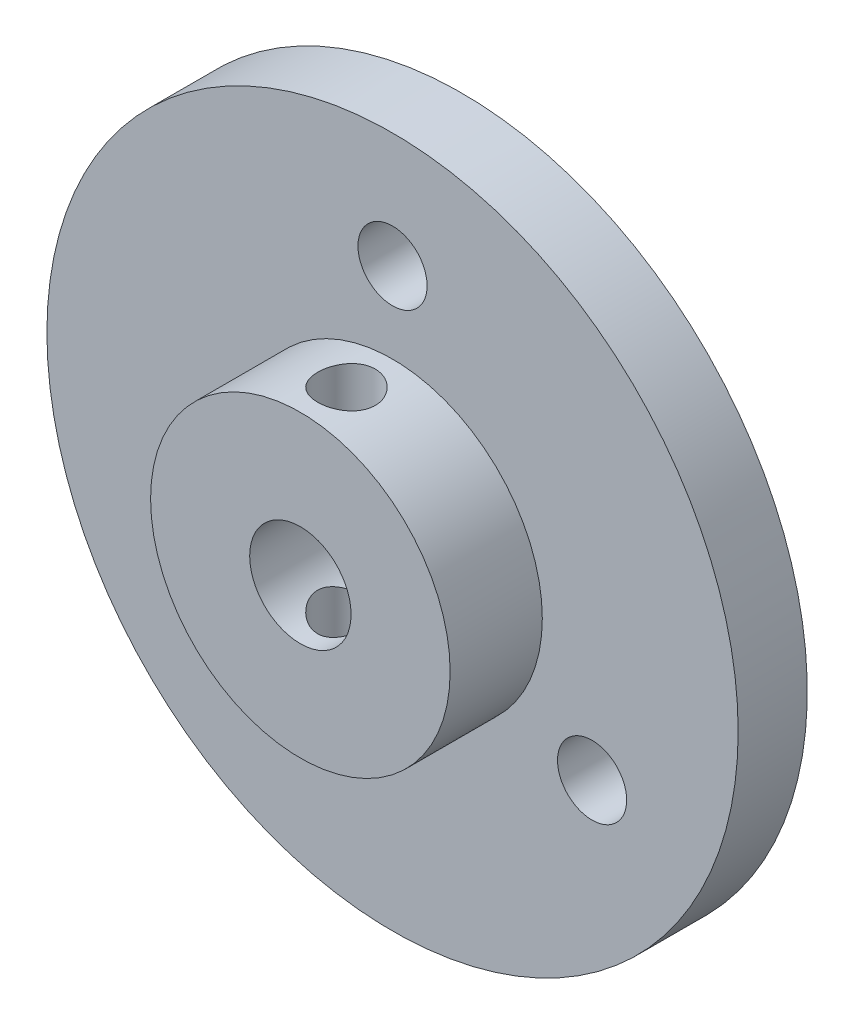
ISO-10303-21;
HEADER;
FILE_DESCRIPTION(('STEP AP214'),'2;1');
FILE_NAME('part.step','',(''),(''),'','','');
FILE_SCHEMA(('AUTOMOTIVE_DESIGN { 1 0 10303 214 1 1 1 1 }'));
ENDSEC;
DATA;
#1=APPLICATION_CONTEXT('core data for automotive mechanical design processes');
#2=APPLICATION_PROTOCOL_DEFINITION('international standard','automotive_design',2000,#1);
#3=PRODUCT_CONTEXT('',#1,'mechanical');
#4=PRODUCT('Part','Part','',(#3));
#5=PRODUCT_RELATED_PRODUCT_CATEGORY('part','',(#4));
#6=PRODUCT_DEFINITION_FORMATION('','',#4);
#7=PRODUCT_DEFINITION_CONTEXT('part definition',#1,'design');
#8=PRODUCT_DEFINITION('design','',#6,#7);
#9=PRODUCT_DEFINITION_SHAPE('','',#8);
#10=(LENGTH_UNIT() NAMED_UNIT(*) SI_UNIT(.MILLI.,.METRE.));
#11=(NAMED_UNIT(*) PLANE_ANGLE_UNIT() SI_UNIT($,.RADIAN.));
#12=(NAMED_UNIT(*) SI_UNIT($,.STERADIAN.) SOLID_ANGLE_UNIT());
#13=UNCERTAINTY_MEASURE_WITH_UNIT(LENGTH_MEASURE(1.E-05),#10,'distance_accuracy_value','');
#14=(GEOMETRIC_REPRESENTATION_CONTEXT(3) GLOBAL_UNCERTAINTY_ASSIGNED_CONTEXT((#13)) GLOBAL_UNIT_ASSIGNED_CONTEXT((#10,
#11,#12)) REPRESENTATION_CONTEXT('',''));
#15=CARTESIAN_POINT('',(0.,0.,0.));
#16=DIRECTION('',(0.,0.,1.));
#17=DIRECTION('',(1.,0.,0.));
#18=AXIS2_PLACEMENT_3D('',#15,#16,#17);
#19=CARTESIAN_POINT('',(0.,0.,5.));
#20=DIRECTION('',(0.,0.,-1.));
#21=DIRECTION('',(-1.,0.,0.));
#22=AXIS2_PLACEMENT_3D('',#19,#20,#21);
#23=CYLINDRICAL_SURFACE('',#22,2.2);
#24=CARTESIAN_POINT('',(0.,-2.2,5.75));
#25=CARTESIAN_POINT('',(0.0645125300504055,-2.1999935000698,5.75000750978721));
#26=CARTESIAN_POINT('',(0.129124215125951,-2.19713053267047,5.75502880134467));
#27=CARTESIAN_POINT('',(0.256436813010199,-2.18594405197788,5.77488156587991));
#28=CARTESIAN_POINT('',(0.319132204525361,-2.17760607864912,5.78973901799355));
#29=CARTESIAN_POINT('',(0.440491943414153,-2.15632645916169,5.82846097924669));
#30=CARTESIAN_POINT('',(0.499173909452813,-2.14340671297006,5.8522826736252));
#31=CARTESIAN_POINT('',(0.611552202061396,-2.11409108527797,5.9080103137288));
#32=CARTESIAN_POINT('',(0.665250008777755,-2.09769624055776,5.93991384882523));
#33=CARTESIAN_POINT('',(0.7704953390529,-2.061468346548,6.01346571922351));
#34=CARTESIAN_POINT('',(0.82161214357486,-2.04147300814532,6.05564900074163));
#35=CARTESIAN_POINT('',(0.916464261885184,-2.00069106883413,6.14738399305678));
#36=CARTESIAN_POINT('',(0.960190856248701,-1.97990356821934,6.19694427987368));
#37=CARTESIAN_POINT('',(1.04375323595796,-1.93726764100164,6.30831212127185));
#38=CARTESIAN_POINT('',(1.0826701890197,-1.91554417486682,6.37086295081197));
#39=CARTESIAN_POINT('',(1.14926833244869,-1.87634854609029,6.50288197564511));
#40=CARTESIAN_POINT('',(1.17696638687829,-1.8588700184832,6.57233959153345));
#41=CARTESIAN_POINT('',(1.21503830441474,-1.83414281613951,6.70062292125709));
#42=CARTESIAN_POINT('',(1.22787758311742,-1.82549216858837,6.75844635902605));
#43=CARTESIAN_POINT('',(1.24523107055081,-1.81370191478066,6.87585758672383));
#44=CARTESIAN_POINT('',(1.24975405187722,-1.81055650139762,6.9354434500071));
#45=CARTESIAN_POINT('',(1.25022668478982,-1.8102301971553,7.05474205959951));
#46=CARTESIAN_POINT('',(1.24616513126616,-1.81305710176333,7.11445486998399));
#47=CARTESIAN_POINT('',(1.22968565843679,-1.82427198168405,7.23219029939607));
#48=CARTESIAN_POINT('',(1.21726205238554,-1.83266374140671,7.29021174014703));
#49=CARTESIAN_POINT('',(1.18471651003865,-1.85386565881248,7.40296860677939));
#50=CARTESIAN_POINT('',(1.16461759841763,-1.86666259048382,7.45771329963948));
#51=CARTESIAN_POINT('',(1.11741736478498,-1.89529387236703,7.56322569456599));
#52=CARTESIAN_POINT('',(1.09031335206425,-1.91112938911768,7.61399185866481));
#53=CARTESIAN_POINT('',(1.02490341865448,-1.94709392714353,7.71865220004875));
#54=CARTESIAN_POINT('',(0.985502746523964,-1.96750559967291,7.77176599766628));
#55=CARTESIAN_POINT('',(0.89887864771186,-2.00856114648935,7.87112985048693));
#56=CARTESIAN_POINT('',(0.851648651999935,-2.02920520207938,7.91737407961508));
#57=CARTESIAN_POINT('',(0.744404677410381,-2.07111789681734,8.00685747127145));
#58=CARTESIAN_POINT('',(0.683553050277902,-2.09220056182402,8.04919012087268));
#59=CARTESIAN_POINT('',(0.554299198513964,-2.13008813321503,8.12284160620309));
#60=CARTESIAN_POINT('',(0.485901822316644,-2.14689576378506,8.15416746068581));
#61=CARTESIAN_POINT('',(0.348400000210749,-2.17328550011754,8.202518427353));
#62=CARTESIAN_POINT('',(0.279675759522216,-2.18328892363227,8.22038679839669));
#63=CARTESIAN_POINT('',(0.13958517704438,-2.19669056258427,8.24420653330947));
#64=CARTESIAN_POINT('',(0.0682214506311412,-2.20009514688732,8.25016938794838));
#65=CARTESIAN_POINT('',(-0.0658860948731496,-2.19991213307091,8.24984365560604));
#66=CARTESIAN_POINT('',(-0.128639723657413,-2.19711234365759,8.24493547392835));
#67=CARTESIAN_POINT('',(-0.252265141157631,-2.18636931869288,8.22587643393109));
#68=CARTESIAN_POINT('',(-0.31313689119072,-2.178425977487,8.21172538575235));
#69=CARTESIAN_POINT('',(-0.430882979868021,-2.15821265351607,8.17499509641195));
#70=CARTESIAN_POINT('',(-0.487787892349176,-2.14598152918216,8.15249144724571));
#71=CARTESIAN_POINT('',(-0.597057844798601,-2.11818424256415,8.09986503615719));
#72=CARTESIAN_POINT('',(-0.649421762899288,-2.1026172594237,8.06974039860465));
#73=CARTESIAN_POINT('',(-0.753983360286923,-2.06757261755562,7.99919485936125));
#74=CARTESIAN_POINT('',(-0.805597925069828,-2.04785665410459,7.95802917211523));
#75=CARTESIAN_POINT('',(-0.901587288797228,-2.00745081425729,7.86831106404944));
#76=CARTESIAN_POINT('',(-0.945953737915314,-1.98675984950957,7.81975024669689));
#77=CARTESIAN_POINT('',(-1.03112229831932,-1.94404085072361,7.71035505115483));
#78=CARTESIAN_POINT('',(-1.07100442366124,-1.9221139508214,7.64875925656056));
#79=CARTESIAN_POINT('',(-1.1397381404391,-1.88217537756037,7.51855276625168));
#80=CARTESIAN_POINT('',(-1.16860462583278,-1.86415843198207,7.44995170250226));
#81=CARTESIAN_POINT('',(-1.20910649667352,-1.8380735129476,7.32253910505749));
#82=CARTESIAN_POINT('',(-1.22309984294953,-1.82870502789061,7.26474449470201));
#83=CARTESIAN_POINT('',(-1.24273290635711,-1.81542296667816,7.14716431899711));
#84=CARTESIAN_POINT('',(-1.24838188871389,-1.81150334062781,7.08738103734718));
#85=CARTESIAN_POINT('',(-1.25101743942415,-1.80968472431745,6.96741869762595));
#86=CARTESIAN_POINT('',(-1.24798802350338,-1.81179684358185,6.90723911319632));
#87=CARTESIAN_POINT('',(-1.23341495015239,-1.82174678174221,6.78839385866664));
#88=CARTESIAN_POINT('',(-1.22186588240239,-1.82958823896677,6.7297291751021));
#89=CARTESIAN_POINT('',(-1.19106635069495,-1.84978103597501,6.61623823833695));
#90=CARTESIAN_POINT('',(-1.17192767781664,-1.86206669386112,6.56136928085092));
#91=CARTESIAN_POINT('',(-1.12664080810194,-1.88981055851969,6.45548122975111));
#92=CARTESIAN_POINT('',(-1.10048999612345,-1.9052699484144,6.40446358157945));
#93=CARTESIAN_POINT('',(-1.03728438331216,-1.94049999577426,6.29938936835259));
#94=CARTESIAN_POINT('',(-0.99917199389012,-1.96056817506352,6.24606841254065));
#95=CARTESIAN_POINT('',(-0.915191808233972,-2.00115004314792,6.14607237738449));
#96=CARTESIAN_POINT('',(-0.869317430251917,-2.02166409704625,6.09940300061607));
#97=CARTESIAN_POINT('',(-0.76454562753266,-2.0637406349251,6.00836209000287));
#98=CARTESIAN_POINT('',(-0.704745652408061,-2.08513280094762,5.96494086865981));
#99=CARTESIAN_POINT('',(-0.57743183454471,-2.12390757778855,5.88889489990016));
#100=CARTESIAN_POINT('',(-0.509922304743205,-2.14129241414488,5.85626415541322));
#101=CARTESIAN_POINT('',(-0.381547251375792,-2.1674707359639,5.80804384288297));
#102=CARTESIAN_POINT('',(-0.32162625399946,-2.17724101641887,5.79045852781031));
#103=CARTESIAN_POINT('',(-0.199351064170107,-2.19180725373625,5.76442741376769));
#104=CARTESIAN_POINT('',(-0.137004569381217,-2.19661779678598,5.75595481185089));
#105=CARTESIAN_POINT('',(-0.0496175728142117,-2.19958232331797,5.75073612198217));
#106=CARTESIAN_POINT('',(-0.0248161224934274,-2.20000250033697,5.74999711119996));
#107=CARTESIAN_POINT('',(0.,-2.2,5.75));
#108=B_SPLINE_CURVE_WITH_KNOTS('',3,(#24,#25,#26,#27,#28,#29,#30,#31,#32,#33,#34,#35,#36,#37,
#38,#39,#40,#41,#42,#43,#44,#45,#46,#47,#48,#49,#50,#51,#52,#53,#54,#55,#56,#57,#58,#59,#60,#61,
#62,#63,#64,#65,#66,#67,#68,#69,#70,#71,#72,#73,#74,#75,#76,#77,#78,#79,#80,#81,#82,#83,#84,#85,
#86,#87,#88,#89,#90,#91,#92,#93,#94,#95,#96,#97,#98,#99,#100,#101,#102,#103,#104,#105,#106,
#107),.UNSPECIFIED.,.T.,.F.,(4,2,2,2,2,2,2,2,2,2,2,2,2,2,2,2,2,2,2,2,2,2,2,2,2,2,2,2,2,2,2,2,2,
2,2,2,2,2,2,2,2,4),(0.,0.193459534884852,0.38743208194227,0.580489705167528,0.773489811374056,
0.980337607743781,1.18742777746208,1.41670612395368,1.64563853244744,1.82444161661561,
2.00305597868954,2.18190362415792,2.3608730208408,2.53930970297801,2.71781502603779,
2.92462458547851,3.13160855065776,3.36161721928643,3.59147894990456,3.80534982693079,
4.01901418361705,4.20711586463386,4.39522140959823,4.58166451495075,4.76815355123676,
4.97402829654883,5.18013856213447,5.40878259197567,5.63711637355297,5.81693592788043,
5.99655566777781,6.17650645218527,6.35657161102196,6.53407754602858,6.71164977327993,
6.91647923056633,7.12148325068583,7.3511261871838,7.58064127867737,7.76945900726596,
7.95771984035635,8.03213818221138),.UNSPECIFIED.);
#109=CARTESIAN_POINT('',(0.,-2.2,5.75));
#110=VERTEX_POINT('',#109);
#111=EDGE_CURVE('E95',#110,#110,#108,.T.);
#112=ORIENTED_EDGE('',*,*,#111,.T.);
#113=EDGE_LOOP('',(#112));
#114=FACE_BOUND('',#113,.T.);
#115=CARTESIAN_POINT('',(0.,2.2,8.25));
#116=CARTESIAN_POINT('',(-0.064512530050405,2.1999935000698,8.2499924902128));
#117=CARTESIAN_POINT('',(-0.129124215125951,2.19713053267047,8.24497119865533));
#118=CARTESIAN_POINT('',(-0.256436813010199,2.18594405197788,8.22511843412009));
#119=CARTESIAN_POINT('',(-0.31913220452536,2.17760607864912,8.21026098200645));
#120=CARTESIAN_POINT('',(-0.440491943414151,2.15632645916169,8.17153902075331));
#121=CARTESIAN_POINT('',(-0.499173909452811,2.14340671297006,8.1477173263748));
#122=CARTESIAN_POINT('',(-0.611552202061395,2.11409108527797,8.0919896862712));
#123=CARTESIAN_POINT('',(-0.665250008777754,2.09769624055776,8.06008615117478));
#124=CARTESIAN_POINT('',(-0.770495339052898,2.061468346548,7.98653428077649));
#125=CARTESIAN_POINT('',(-0.821612143574858,2.04147300814532,7.94435099925837));
#126=CARTESIAN_POINT('',(-0.916464261885183,2.00069106883413,7.85261600694323));
#127=CARTESIAN_POINT('',(-0.9601908562487,1.97990356821934,7.80305572012632));
#128=CARTESIAN_POINT('',(-1.04375323595796,1.93726764100164,7.69168787872815));
#129=CARTESIAN_POINT('',(-1.0826701890197,1.91554417486682,7.62913704918803));
#130=CARTESIAN_POINT('',(-1.14926833244869,1.87634854609029,7.49711802435489));
#131=CARTESIAN_POINT('',(-1.17696638687829,1.8588700184832,7.42766040846655));
#132=CARTESIAN_POINT('',(-1.21503830441474,1.83414281613951,7.29937707874291));
#133=CARTESIAN_POINT('',(-1.22787758311742,1.82549216858837,7.24155364097395));
#134=CARTESIAN_POINT('',(-1.24523107055081,1.81370191478066,7.12414241327617));
#135=CARTESIAN_POINT('',(-1.24975405187722,1.81055650139762,7.0645565499929));
#136=CARTESIAN_POINT('',(-1.25022668478982,1.8102301971553,6.94525794040049));
#137=CARTESIAN_POINT('',(-1.24616513126615,1.81305710176333,6.88554513001601));
#138=CARTESIAN_POINT('',(-1.22968565843679,1.82427198168406,6.76780970060393));
#139=CARTESIAN_POINT('',(-1.21726205238554,1.83266374140671,6.70978825985297));
#140=CARTESIAN_POINT('',(-1.18471651003865,1.85386565881248,6.59703139322061));
#141=CARTESIAN_POINT('',(-1.16461759841763,1.86666259048382,6.54228670036053));
#142=CARTESIAN_POINT('',(-1.11741736478498,1.89529387236703,6.43677430543401));
#143=CARTESIAN_POINT('',(-1.09031335206425,1.91112938911768,6.38600814133519));
#144=CARTESIAN_POINT('',(-1.02490341865448,1.94709392714353,6.28134779995126));
#145=CARTESIAN_POINT('',(-0.985502746523963,1.96750559967291,6.22823400233372));
#146=CARTESIAN_POINT('',(-0.898878647711859,2.00856114648935,6.12887014951308));
#147=CARTESIAN_POINT('',(-0.851648651999934,2.02920520207938,6.08262592038492));
#148=CARTESIAN_POINT('',(-0.74440467741038,2.07111789681734,5.99314252872855));
#149=CARTESIAN_POINT('',(-0.683553050277901,2.09220056182402,5.95080987912733));
#150=CARTESIAN_POINT('',(-0.554299198513962,2.13008813321503,5.87715839379692));
#151=CARTESIAN_POINT('',(-0.485901822316642,2.14689576378506,5.84583253931419));
#152=CARTESIAN_POINT('',(-0.348400000210747,2.17328550011754,5.79748157264701));
#153=CARTESIAN_POINT('',(-0.279675759522215,2.18328892363227,5.77961320160331));
#154=CARTESIAN_POINT('',(-0.139585177044378,2.19669056258427,5.75579346669053));
#155=CARTESIAN_POINT('',(-0.0682214506311398,2.20009514688732,5.74983061205162));
#156=CARTESIAN_POINT('',(0.0658860948731507,2.19991213307091,5.75015634439396));
#157=CARTESIAN_POINT('',(0.128639723657414,2.19711234365759,5.75506452607165));
#158=CARTESIAN_POINT('',(0.252265141157632,2.18636931869288,5.77412356606891));
#159=CARTESIAN_POINT('',(0.313136891190721,2.178425977487,5.78827461424765));
#160=CARTESIAN_POINT('',(0.430882979868022,2.15821265351607,5.82500490358805));
#161=CARTESIAN_POINT('',(0.487787892349177,2.14598152918216,5.84750855275429));
#162=CARTESIAN_POINT('',(0.597057844798602,2.11818424256415,5.90013496384282));
#163=CARTESIAN_POINT('',(0.649421762899289,2.1026172594237,5.93025960139535));
#164=CARTESIAN_POINT('',(0.753983360286924,2.06757261755562,6.00080514063875));
#165=CARTESIAN_POINT('',(0.805597925069829,2.04785665410459,6.04197082788477));
#166=CARTESIAN_POINT('',(0.901587288797229,2.00745081425729,6.13168893595056));
#167=CARTESIAN_POINT('',(0.945953737915315,1.98675984950957,6.18024975330311));
#168=CARTESIAN_POINT('',(1.03112229831932,1.94404085072361,6.28964494884517));
#169=CARTESIAN_POINT('',(1.07100442366124,1.9221139508214,6.35124074343944));
#170=CARTESIAN_POINT('',(1.1397381404391,1.88217537756037,6.48144723374832));
#171=CARTESIAN_POINT('',(1.16860462583278,1.86415843198207,6.55004829749774));
#172=CARTESIAN_POINT('',(1.20910649667352,1.8380735129476,6.67746089494252));
#173=CARTESIAN_POINT('',(1.22309984294953,1.82870502789061,6.73525550529799));
#174=CARTESIAN_POINT('',(1.24273290635711,1.81542296667816,6.8528356810029));
#175=CARTESIAN_POINT('',(1.24838188871389,1.81150334062781,6.91261896265282));
#176=CARTESIAN_POINT('',(1.25101743942415,1.80968472431745,7.03258130237406));
#177=CARTESIAN_POINT('',(1.24798802350338,1.81179684358185,7.09276088680369));
#178=CARTESIAN_POINT('',(1.23341495015239,1.82174678174221,7.21160614133337));
#179=CARTESIAN_POINT('',(1.22186588240239,1.82958823896677,7.27027082489791));
#180=CARTESIAN_POINT('',(1.19106635069495,1.84978103597501,7.38376176166306));
#181=CARTESIAN_POINT('',(1.17192767781664,1.86206669386112,7.43863071914909));
#182=CARTESIAN_POINT('',(1.12664080810194,1.88981055851969,7.54451877024889));
#183=CARTESIAN_POINT('',(1.10048999612345,1.9052699484144,7.59553641842055));
#184=CARTESIAN_POINT('',(1.03728438331216,1.94049999577426,7.70061063164741));
#185=CARTESIAN_POINT('',(0.99917199389012,1.96056817506352,7.75393158745935));
#186=CARTESIAN_POINT('',(0.915191808233972,2.00115004314792,7.85392762261551));
#187=CARTESIAN_POINT('',(0.869317430251917,2.02166409704625,7.90059699938393));
#188=CARTESIAN_POINT('',(0.76454562753266,2.0637406349251,7.99163790999713));
#189=CARTESIAN_POINT('',(0.704745652408062,2.08513280094762,8.03505913134019));
#190=CARTESIAN_POINT('',(0.577431834544711,2.12390757778855,8.11110510009985));
#191=CARTESIAN_POINT('',(0.509922304743205,2.14129241414488,8.14373584458678));
#192=CARTESIAN_POINT('',(0.381547251375791,2.1674707359639,8.19195615711703));
#193=CARTESIAN_POINT('',(0.321626253999459,2.17724101641887,8.20954147218969));
#194=CARTESIAN_POINT('',(0.199351064170106,2.19180725373625,8.23557258623231));
#195=CARTESIAN_POINT('',(0.137004569381217,2.19661779678598,8.24404518814911));
#196=CARTESIAN_POINT('',(0.0496175728142115,2.19958232331797,8.24926387801784));
#197=CARTESIAN_POINT('',(0.0248161224934276,2.20000250033697,8.25000288880004));
#198=CARTESIAN_POINT('',(0.,2.2,8.25));
#199=B_SPLINE_CURVE_WITH_KNOTS('',3,(#115,#116,#117,#118,#119,#120,#121,#122,#123,#124,#125,
#126,#127,#128,#129,#130,#131,#132,#133,#134,#135,#136,#137,#138,#139,#140,#141,#142,#143,#144,
#145,#146,#147,#148,#149,#150,#151,#152,#153,#154,#155,#156,#157,#158,#159,#160,#161,#162,#163,
#164,#165,#166,#167,#168,#169,#170,#171,#172,#173,#174,#175,#176,#177,#178,#179,#180,#181,#182,
#183,#184,#185,#186,#187,#188,#189,#190,#191,#192,#193,#194,#195,#196,#197,#198),.UNSPECIFIED.,
.T.,.F.,(4,2,2,2,2,2,2,2,2,2,2,2,2,2,2,2,2,2,2,2,2,2,2,2,2,2,2,2,2,2,2,2,2,2,2,2,2,2,2,2,2,4),
(0.,0.193459534884852,0.38743208194227,0.580489705167526,0.773489811374056,0.98033760774378,
1.18742777746208,1.41670612395368,1.64563853244743,1.82444161661561,2.00305597868954,
2.18190362415792,2.3608730208408,2.53930970297801,2.71781502603779,2.92462458547851,
3.13160855065776,3.36161721928643,3.59147894990456,3.80534982693079,4.01901418361705,
4.20711586463386,4.39522140959823,4.58166451495075,4.76815355123676,4.97402829654883,
5.18013856213447,5.40878259197567,5.63711637355297,5.81693592788043,5.99655566777781,
6.17650645218527,6.35657161102196,6.53407754602858,6.71164977327992,6.91647923056633,
7.12148325068583,7.3511261871838,7.58064127867737,7.76945900726596,7.95771984035635,
8.03213818221138),.UNSPECIFIED.);
#200=CARTESIAN_POINT('',(0.,2.2,8.25));
#201=VERTEX_POINT('',#200);
#202=EDGE_CURVE('E80',#201,#201,#199,.T.);
#203=ORIENTED_EDGE('',*,*,#202,.F.);
#204=EDGE_LOOP('',(#203));
#205=FACE_BOUND('',#204,.T.);
#206=CARTESIAN_POINT('',(0.,0.,9.));
#207=DIRECTION('',(0.,0.,1.));
#208=DIRECTION('',(1.,0.,0.));
#209=AXIS2_PLACEMENT_3D('',#206,#207,#208);
#210=CIRCLE('',#209,2.2);
#211=CARTESIAN_POINT('',(2.2,0.,9.));
#212=VERTEX_POINT('',#211);
#213=EDGE_CURVE('E157',#212,#212,#210,.F.);
#214=ORIENTED_EDGE('',*,*,#213,.F.);
#215=EDGE_LOOP('',(#214));
#216=FACE_BOUND('',#215,.T.);
#217=CARTESIAN_POINT('',(0.,0.,2.));
#218=DIRECTION('',(0.,0.,-1.));
#219=DIRECTION('',(-1.,0.,0.));
#220=AXIS2_PLACEMENT_3D('',#217,#218,#219);
#221=CIRCLE('',#220,2.2);
#222=CARTESIAN_POINT('',(-2.2,0.,2.));
#223=VERTEX_POINT('',#222);
#224=EDGE_CURVE('E167',#223,#223,#221,.T.);
#225=ORIENTED_EDGE('',*,*,#224,.T.);
#226=EDGE_LOOP('',(#225));
#227=FACE_BOUND('',#226,.T.);
#228=ADVANCED_FACE('F57',(#114,#205,#216,#227),#23,.F.);
#229=CARTESIAN_POINT('',(0.,0.,5.));
#230=DIRECTION('',(0.,0.,-1.));
#231=DIRECTION('',(-1.,0.,0.));
#232=AXIS2_PLACEMENT_3D('',#229,#230,#231);
#233=CYLINDRICAL_SURFACE('',#232,15.);
#234=CARTESIAN_POINT('',(0.,0.,5.));
#235=DIRECTION('',(0.,0.,1.));
#236=DIRECTION('',(1.,0.,0.));
#237=AXIS2_PLACEMENT_3D('',#234,#235,#236);
#238=CIRCLE('',#237,15.);
#239=CARTESIAN_POINT('',(15.,0.,5.));
#240=VERTEX_POINT('',#239);
#241=EDGE_CURVE('E11',#240,#240,#238,.T.);
#242=ORIENTED_EDGE('',*,*,#241,.F.);
#243=EDGE_LOOP('',(#242));
#244=FACE_BOUND('',#243,.T.);
#245=CARTESIAN_POINT('',(0.,0.,2.));
#246=DIRECTION('',(0.,0.,-1.));
#247=DIRECTION('',(-1.,0.,0.));
#248=AXIS2_PLACEMENT_3D('',#245,#246,#247);
#249=CIRCLE('',#248,15.);
#250=CARTESIAN_POINT('',(-15.,0.,2.));
#251=VERTEX_POINT('',#250);
#252=EDGE_CURVE('E177',#251,#251,#249,.T.);
#253=ORIENTED_EDGE('',*,*,#252,.F.);
#254=EDGE_LOOP('',(#253));
#255=FACE_BOUND('',#254,.T.);
#256=ADVANCED_FACE('F59',(#244,#255),#233,.T.);
#257=CARTESIAN_POINT('',(0.,10.,5.));
#258=DIRECTION('',(0.,0.,-1.));
#259=DIRECTION('',(-1.,0.,0.));
#260=AXIS2_PLACEMENT_3D('',#257,#258,#259);
#261=CYLINDRICAL_SURFACE('',#260,1.5);
#262=CARTESIAN_POINT('',(0.,10.,5.));
#263=DIRECTION('',(0.,0.,1.));
#264=DIRECTION('',(1.,0.,0.));
#265=AXIS2_PLACEMENT_3D('',#262,#263,#264);
#266=CIRCLE('',#265,1.5);
#267=CARTESIAN_POINT('',(1.5,10.,5.));
#268=VERTEX_POINT('',#267);
#269=EDGE_CURVE('E65',#268,#268,#266,.T.);
#270=ORIENTED_EDGE('',*,*,#269,.T.);
#271=EDGE_LOOP('',(#270));
#272=FACE_BOUND('',#271,.T.);
#273=CARTESIAN_POINT('',(0.,10.,2.));
#274=DIRECTION('',(0.,0.,-1.));
#275=DIRECTION('',(-1.,0.,0.));
#276=AXIS2_PLACEMENT_3D('',#273,#274,#275);
#277=CIRCLE('',#276,1.5);
#278=CARTESIAN_POINT('',(-1.5,10.,2.));
#279=VERTEX_POINT('',#278);
#280=EDGE_CURVE('E169',#279,#279,#277,.T.);
#281=ORIENTED_EDGE('',*,*,#280,.T.);
#282=EDGE_LOOP('',(#281));
#283=FACE_BOUND('',#282,.T.);
#284=ADVANCED_FACE('F125',(#272,#283),#261,.F.);
#285=CARTESIAN_POINT('',(8.66025403784439,-5.,5.));
#286=DIRECTION('',(0.,0.,-1.));
#287=DIRECTION('',(-1.,0.,0.));
#288=AXIS2_PLACEMENT_3D('',#285,#286,#287);
#289=CYLINDRICAL_SURFACE('',#288,1.5);
#290=CARTESIAN_POINT('',(8.66025403784439,-5.,5.));
#291=DIRECTION('',(0.,0.,1.));
#292=DIRECTION('',(1.,0.,0.));
#293=AXIS2_PLACEMENT_3D('',#290,#291,#292);
#294=CIRCLE('',#293,1.5);
#295=CARTESIAN_POINT('',(10.1602540378444,-5.,5.));
#296=VERTEX_POINT('',#295);
#297=EDGE_CURVE('E70',#296,#296,#294,.T.);
#298=ORIENTED_EDGE('',*,*,#297,.T.);
#299=EDGE_LOOP('',(#298));
#300=FACE_BOUND('',#299,.T.);
#301=CARTESIAN_POINT('',(8.66025403784439,-5.,2.));
#302=DIRECTION('',(0.,0.,-1.));
#303=DIRECTION('',(-1.,0.,0.));
#304=AXIS2_PLACEMENT_3D('',#301,#302,#303);
#305=CIRCLE('',#304,1.5);
#306=CARTESIAN_POINT('',(7.16025403784439,-5.,2.));
#307=VERTEX_POINT('',#306);
#308=EDGE_CURVE('E172',#307,#307,#305,.T.);
#309=ORIENTED_EDGE('',*,*,#308,.T.);
#310=EDGE_LOOP('',(#309));
#311=FACE_BOUND('',#310,.T.);
#312=ADVANCED_FACE('F121',(#300,#311),#289,.F.);
#313=CARTESIAN_POINT('',(-8.66025403784438,-5.00000000000001,5.));
#314=DIRECTION('',(0.,0.,-1.));
#315=DIRECTION('',(-1.,0.,0.));
#316=AXIS2_PLACEMENT_3D('',#313,#314,#315);
#317=CYLINDRICAL_SURFACE('',#316,1.5);
#318=CARTESIAN_POINT('',(-8.66025403784438,-5.00000000000001,5.));
#319=DIRECTION('',(0.,0.,1.));
#320=DIRECTION('',(1.,0.,0.));
#321=AXIS2_PLACEMENT_3D('',#318,#319,#320);
#322=CIRCLE('',#321,1.5);
#323=CARTESIAN_POINT('',(-7.16025403784438,-5.00000000000001,5.));
#324=VERTEX_POINT('',#323);
#325=EDGE_CURVE('E153',#324,#324,#322,.T.);
#326=ORIENTED_EDGE('',*,*,#325,.T.);
#327=EDGE_LOOP('',(#326));
#328=FACE_BOUND('',#327,.T.);
#329=CARTESIAN_POINT('',(-8.66025403784438,-5.00000000000001,2.));
#330=DIRECTION('',(0.,0.,-1.));
#331=DIRECTION('',(-1.,0.,0.));
#332=AXIS2_PLACEMENT_3D('',#329,#330,#331);
#333=CIRCLE('',#332,1.5);
#334=CARTESIAN_POINT('',(-10.1602540378444,-5.00000000000001,2.));
#335=VERTEX_POINT('',#334);
#336=EDGE_CURVE('E61',#335,#335,#333,.T.);
#337=ORIENTED_EDGE('',*,*,#336,.T.);
#338=EDGE_LOOP('',(#337));
#339=FACE_BOUND('',#338,.T.);
#340=ADVANCED_FACE('F117',(#328,#339),#317,.F.);
#341=CARTESIAN_POINT('',(0.,0.,9.));
#342=DIRECTION('',(0.,0.,-1.));
#343=DIRECTION('',(-1.,0.,0.));
#344=AXIS2_PLACEMENT_3D('',#341,#342,#343);
#345=CYLINDRICAL_SURFACE('',#344,6.5);
#346=CARTESIAN_POINT('',(0.,0.,5.));
#347=DIRECTION('',(0.,0.,1.));
#348=DIRECTION('',(1.,0.,0.));
#349=AXIS2_PLACEMENT_3D('',#346,#347,#348);
#350=CIRCLE('',#349,6.5);
#351=CARTESIAN_POINT('',(6.5,0.,5.));
#352=VERTEX_POINT('',#351);
#353=EDGE_CURVE('E145',#352,#352,#350,.T.);
#354=ORIENTED_EDGE('',*,*,#353,.T.);
#355=EDGE_LOOP('',(#354));
#356=FACE_BOUND('',#355,.T.);
#357=CARTESIAN_POINT('',(0.,0.,9.));
#358=DIRECTION('',(0.,0.,1.));
#359=DIRECTION('',(1.,0.,0.));
#360=AXIS2_PLACEMENT_3D('',#357,#358,#359);
#361=CIRCLE('',#360,6.5);
#362=CARTESIAN_POINT('',(6.5,0.,9.));
#363=VERTEX_POINT('',#362);
#364=EDGE_CURVE('E154',#363,#363,#361,.T.);
#365=ORIENTED_EDGE('',*,*,#364,.F.);
#366=EDGE_LOOP('',(#365));
#367=FACE_BOUND('',#366,.T.);
#368=CARTESIAN_POINT('',(0.,6.5,8.25));
#369=CARTESIAN_POINT('',(-0.0695263300903765,6.49999873054918,8.24999737939015));
#370=CARTESIAN_POINT('',(-0.139086386536077,6.49887299034978,8.24417970635101));
#371=CARTESIAN_POINT('',(-0.27624406654568,6.49449072478032,8.22107902756889));
#372=CARTESIAN_POINT('',(-0.343840022447299,6.49123244093525,8.20378655965699));
#373=CARTESIAN_POINT('',(-0.475066268731186,6.48294932466697,8.15828720975593));
#374=CARTESIAN_POINT('',(-0.538700159856868,6.47792612463065,8.13009041086318));
#375=CARTESIAN_POINT('',(-0.660328619211792,6.46666077439192,8.06361193603687));
#376=CARTESIAN_POINT('',(-0.718323597744222,6.46041871297687,8.02533099460691));
#377=CARTESIAN_POINT('',(-0.82776216487111,6.44731615012176,7.93926041714611));
#378=CARTESIAN_POINT('',(-0.879124647683769,6.44044947743084,7.89136858427445));
#379=CARTESIAN_POINT('',(-0.973138343078083,6.42691706808667,7.78765548140267));
#380=CARTESIAN_POINT('',(-1.01578890972676,6.42025134636388,7.73183362396171));
#381=CARTESIAN_POINT('',(-1.09150839810311,6.4078154700976,7.6132680023211));
#382=CARTESIAN_POINT('',(-1.12449425725113,6.40205326632547,7.55047028444983));
#383=CARTESIAN_POINT('',(-1.17941610157594,6.39216406280365,7.42009504498672));
#384=CARTESIAN_POINT('',(-1.20135309167639,6.38803691434868,7.35251795872879));
#385=CARTESIAN_POINT('',(-1.23329305228569,6.38194735063818,7.21537190414041));
#386=CARTESIAN_POINT('',(-1.24343779395771,6.37995924110286,7.14583711665146));
#387=CARTESIAN_POINT('',(-1.2519454509238,6.37829543879724,7.00602618154001));
#388=CARTESIAN_POINT('',(-1.25030947843596,6.3786195277321,6.93575010452821));
#389=CARTESIAN_POINT('',(-1.23541697804277,6.38152012920898,6.79748238841897));
#390=CARTESIAN_POINT('',(-1.22232215325027,6.38406529733108,6.72947257761762));
#391=CARTESIAN_POINT('',(-1.18513854067889,6.39107200195107,6.59663350844221));
#392=CARTESIAN_POINT('',(-1.16104926380166,6.39553362370363,6.53180439170637));
#393=CARTESIAN_POINT('',(-1.10240382729656,6.40590301761788,6.40669652809025));
#394=CARTESIAN_POINT('',(-1.06778282798614,6.41181970353635,6.346448944746));
#395=CARTESIAN_POINT('',(-0.989102525446738,6.42442673553149,6.23255751443072));
#396=CARTESIAN_POINT('',(-0.945042216343233,6.43111716402495,6.17891437220416));
#397=CARTESIAN_POINT('',(-0.84786445566334,6.44465411904849,6.07882073288959));
#398=CARTESIAN_POINT('',(-0.794608805779966,6.45150139326972,6.0325044049816));
#399=CARTESIAN_POINT('',(-0.681013328076994,6.46447860514488,5.94944224634974));
#400=CARTESIAN_POINT('',(-0.620673422062239,6.47060853487937,5.91269652127943));
#401=CARTESIAN_POINT('',(-0.494478881244397,6.48147374305158,5.84979697648017));
#402=CARTESIAN_POINT('',(-0.428616856521534,6.48620711303174,5.82365763269142));
#403=CARTESIAN_POINT('',(-0.293325284598557,6.49373123608211,5.78285128832655));
#404=CARTESIAN_POINT('',(-0.223896137321169,6.4965222064135,5.7681830046674));
#405=CARTESIAN_POINT('',(-0.0845949575723079,6.4998170641524,5.75092311692321));
#406=CARTESIAN_POINT('',(-0.0147464889976591,6.50035574677272,5.74814776407948));
#407=CARTESIAN_POINT('',(0.124416318296412,6.49918164994221,5.75425888859832));
#408=CARTESIAN_POINT('',(0.193730684493376,6.497468987103,5.76314476195117));
#409=CARTESIAN_POINT('',(0.329271121290112,6.49200634359786,5.79217337199752));
#410=CARTESIAN_POINT('',(0.395517951862498,6.48827328656802,5.81222263921288));
#411=CARTESIAN_POINT('',(0.523709778000949,6.47918677244289,5.86290739006222));
#412=CARTESIAN_POINT('',(0.585654469459851,6.47383320094063,5.89354362114864));
#413=CARTESIAN_POINT('',(0.704264341336229,6.4620127326735,5.96493587158737));
#414=CARTESIAN_POINT('',(0.760861092631656,6.4555338112679,6.0058035457684));
#415=CARTESIAN_POINT('',(0.866459302715517,6.44221127589378,6.09634811174868));
#416=CARTESIAN_POINT('',(0.915460011904465,6.43536762602225,6.14602587191698));
#417=CARTESIAN_POINT('',(1.00517755082431,6.42197081919612,6.25361408069802));
#418=CARTESIAN_POINT('',(1.04576869619256,6.41542307578637,6.31163012514148));
#419=CARTESIAN_POINT('',(1.11662974416659,6.40347051879715,6.43376516213667));
#420=CARTESIAN_POINT('',(1.14690004216187,6.39806566143697,6.49788392077428));
#421=CARTESIAN_POINT('',(1.19608442093859,6.3890537865887,6.63009317947312));
#422=CARTESIAN_POINT('',(1.21505488797639,6.385437857926,6.69816206673377));
#423=CARTESIAN_POINT('',(1.24127395271723,6.38039343660705,6.83659753660325));
#424=CARTESIAN_POINT('',(1.24852394995944,6.37896468278173,6.9069638438537));
#425=CARTESIAN_POINT('',(1.25104755843674,6.37847010253234,7.04673667796078));
#426=CARTESIAN_POINT('',(1.24651955106104,6.37936513521924,7.11613956148371));
#427=CARTESIAN_POINT('',(1.22605133269021,6.38333023983079,7.2531749722532));
#428=CARTESIAN_POINT('',(1.21011119845593,6.38640029712568,7.32080751140438));
#429=CARTESIAN_POINT('',(1.16735673858749,6.39435266298136,7.45226830992101));
#430=CARTESIAN_POINT('',(1.14056497100194,6.39923121033494,7.51610414795882));
#431=CARTESIAN_POINT('',(1.07688985392764,6.4102533266987,7.63840618094546));
#432=CARTESIAN_POINT('',(1.04000574067459,6.41639699144119,7.69687196905446));
#433=CARTESIAN_POINT('',(0.956507819072144,6.42937795151368,7.80776578734231));
#434=CARTESIAN_POINT('',(0.909750049269229,6.43622463982555,7.86008434074108));
#435=CARTESIAN_POINT('',(0.808131192425045,6.44977101580728,7.95619868774715));
#436=CARTESIAN_POINT('',(0.753268246630375,6.45647066935191,7.99999252103405));
#437=CARTESIAN_POINT('',(0.636368128673318,6.46904328529454,8.07820650842778));
#438=CARTESIAN_POINT('',(0.574267467434711,6.47490774506217,8.11253318503457));
#439=CARTESIAN_POINT('',(0.445086129675209,6.48506595383496,8.17021039618204));
#440=CARTESIAN_POINT('',(0.37801012664743,6.48936115496814,8.19357108393445));
#441=CARTESIAN_POINT('',(0.258961782852774,6.49503671875109,8.22399229210729));
#442=CARTESIAN_POINT('',(0.207678719850839,6.49688729501668,8.23372824487617));
#443=CARTESIAN_POINT('',(0.104270079257343,6.49936939476943,8.24673299181852));
#444=CARTESIAN_POINT('',(0.052144525085164,6.50000095208405,8.25000196544901));
#445=CARTESIAN_POINT('',(0.,6.5,8.25));
#446=B_SPLINE_CURVE_WITH_KNOTS('',3,(#368,#369,#370,#371,#372,#373,#374,#375,#376,#377,#378,
#379,#380,#381,#382,#383,#384,#385,#386,#387,#388,#389,#390,#391,#392,#393,#394,#395,#396,#397,
#398,#399,#400,#401,#402,#403,#404,#405,#406,#407,#408,#409,#410,#411,#412,#413,#414,#415,#416,
#417,#418,#419,#420,#421,#422,#423,#424,#425,#426,#427,#428,#429,#430,#431,#432,#433,#434,#435,
#436,#437,#438,#439,#440,#441,#442,#443,#444,#445),.UNSPECIFIED.,.T.,.F.,(4,2,2,2,2,2,2,2,2,2,2,
2,2,2,2,2,2,2,2,2,2,2,2,2,2,2,2,2,2,2,2,2,2,2,2,2,2,2,4),(0.,0.208388270286285,
0.416948592398259,0.625316520786647,0.833669276372912,1.0443676620205,1.25508166394262,
1.46755680912121,1.68001262563574,1.88988689492414,2.09974135022729,2.30668132349721,
2.51363050358035,2.72188049935154,2.9301526977684,3.14188196787827,3.35361357524978,
3.56563319670022,3.77762909953165,3.98633752849765,4.19503514754155,4.40201109247083,
4.60900165313827,4.81835785477028,5.0277347031462,5.24004512383251,5.45234741003696,
5.66358123272488,5.87478983015679,6.08246408561773,6.29013694422222,6.49738029642496,
6.70463933664288,6.91515952159825,7.12572806013491,7.33830680136692,7.55068832965364,
7.70698320273414,7.8632737386113),.UNSPECIFIED.);
#447=CARTESIAN_POINT('',(0.,6.5,8.25));
#448=VERTEX_POINT('',#447);
#449=EDGE_CURVE('E73',#448,#448,#446,.T.);
#450=ORIENTED_EDGE('',*,*,#449,.T.);
#451=EDGE_LOOP('',(#450));
#452=FACE_BOUND('',#451,.T.);
#453=CARTESIAN_POINT('',(0.,-6.5,5.75));
#454=CARTESIAN_POINT('',(0.0695263300903771,-6.49999873054918,5.75000262060985));
#455=CARTESIAN_POINT('',(0.139086386536078,-6.49887299034978,5.755820293649));
#456=CARTESIAN_POINT('',(0.276244066545681,-6.49449072478032,5.77892097243111));
#457=CARTESIAN_POINT('',(0.3438400224473,-6.49123244093525,5.79621344034301));
#458=CARTESIAN_POINT('',(0.475066268731186,-6.48294932466697,5.84171279024407));
#459=CARTESIAN_POINT('',(0.538700159856868,-6.47792612463065,5.86990958913682));
#460=CARTESIAN_POINT('',(0.660328619211793,-6.46666077439192,5.93638806396314));
#461=CARTESIAN_POINT('',(0.718323597744222,-6.46041871297687,5.97466900539309));
#462=CARTESIAN_POINT('',(0.827762164871111,-6.44731615012176,6.06073958285389));
#463=CARTESIAN_POINT('',(0.87912464768377,-6.44044947743084,6.10863141572555));
#464=CARTESIAN_POINT('',(0.973138343078084,-6.42691706808667,6.21234451859733));
#465=CARTESIAN_POINT('',(1.01578890972676,-6.42025134636388,6.26816637603829));
#466=CARTESIAN_POINT('',(1.09150839810311,-6.4078154700976,6.3867319976789));
#467=CARTESIAN_POINT('',(1.12449425725113,-6.40205326632547,6.44952971555017));
#468=CARTESIAN_POINT('',(1.17941610157594,-6.39216406280365,6.57990495501328));
#469=CARTESIAN_POINT('',(1.20135309167639,-6.38803691434868,6.64748204127121));
#470=CARTESIAN_POINT('',(1.23329305228569,-6.38194735063818,6.78462809585959));
#471=CARTESIAN_POINT('',(1.24343779395771,-6.37995924110286,6.85416288334854));
#472=CARTESIAN_POINT('',(1.2519454509238,-6.37829543879724,6.99397381845999));
#473=CARTESIAN_POINT('',(1.25030947843596,-6.3786195277321,7.06424989547179));
#474=CARTESIAN_POINT('',(1.23541697804277,-6.38152012920898,7.20251761158104));
#475=CARTESIAN_POINT('',(1.22232215325027,-6.38406529733108,7.27052742238238));
#476=CARTESIAN_POINT('',(1.18513854067889,-6.39107200195106,7.40336649155779));
#477=CARTESIAN_POINT('',(1.16104926380166,-6.39553362370363,7.46819560829363));
#478=CARTESIAN_POINT('',(1.10240382729656,-6.40590301761788,7.59330347190975));
#479=CARTESIAN_POINT('',(1.06778282798614,-6.41181970353635,7.653551055254));
#480=CARTESIAN_POINT('',(0.989102525446738,-6.42442673553149,7.76744248556929));
#481=CARTESIAN_POINT('',(0.945042216343233,-6.43111716402495,7.82108562779584));
#482=CARTESIAN_POINT('',(0.84786445566334,-6.44465411904849,7.92117926711041));
#483=CARTESIAN_POINT('',(0.794608805779967,-6.45150139326972,7.9674955950184));
#484=CARTESIAN_POINT('',(0.681013328076995,-6.46447860514488,8.05055775365027));
#485=CARTESIAN_POINT('',(0.62067342206224,-6.47060853487937,8.08730347872058));
#486=CARTESIAN_POINT('',(0.494478881244398,-6.48147374305158,8.15020302351983));
#487=CARTESIAN_POINT('',(0.428616856521536,-6.48620711303174,8.17634236730858));
#488=CARTESIAN_POINT('',(0.293325284598559,-6.49373123608211,8.21714871167345));
#489=CARTESIAN_POINT('',(0.22389613732117,-6.4965222064135,8.2318169953326));
#490=CARTESIAN_POINT('',(0.0845949575723087,-6.4998170641524,8.24907688307679));
#491=CARTESIAN_POINT('',(0.0147464889976597,-6.50035574677272,8.25185223592053));
#492=CARTESIAN_POINT('',(-0.124416318296412,-6.49918164994221,8.24574111140168));
#493=CARTESIAN_POINT('',(-0.193730684493375,-6.497468987103,8.23685523804883));
#494=CARTESIAN_POINT('',(-0.329271121290111,-6.49200634359786,8.20782662800249));
#495=CARTESIAN_POINT('',(-0.395517951862497,-6.48827328656802,8.18777736078713));
#496=CARTESIAN_POINT('',(-0.523709778000948,-6.47918677244289,8.13709260993778));
#497=CARTESIAN_POINT('',(-0.58565446945985,-6.47383320094063,8.10645637885136));
#498=CARTESIAN_POINT('',(-0.704264341336228,-6.4620127326735,8.03506412841263));
#499=CARTESIAN_POINT('',(-0.760861092631656,-6.4555338112679,7.9941964542316));
#500=CARTESIAN_POINT('',(-0.866459302715517,-6.44221127589378,7.90365188825132));
#501=CARTESIAN_POINT('',(-0.915460011904465,-6.43536762602225,7.85397412808302));
#502=CARTESIAN_POINT('',(-1.00517755082431,-6.42197081919612,7.74638591930199));
#503=CARTESIAN_POINT('',(-1.04576869619256,-6.41542307578637,7.68836987485852));
#504=CARTESIAN_POINT('',(-1.11662974416659,-6.40347051879715,7.56623483786333));
#505=CARTESIAN_POINT('',(-1.14690004216187,-6.39806566143697,7.50211607922572));
#506=CARTESIAN_POINT('',(-1.19608442093859,-6.3890537865887,7.36990682052689));
#507=CARTESIAN_POINT('',(-1.21505488797639,-6.385437857926,7.30183793326623));
#508=CARTESIAN_POINT('',(-1.24127395271723,-6.38039343660705,7.16340246339675));
#509=CARTESIAN_POINT('',(-1.24852394995944,-6.37896468278173,7.0930361561463));
#510=CARTESIAN_POINT('',(-1.25104755843674,-6.37847010253234,6.95326332203922));
#511=CARTESIAN_POINT('',(-1.24651955106104,-6.37936513521924,6.88386043851629));
#512=CARTESIAN_POINT('',(-1.22605133269021,-6.38333023983079,6.7468250277468));
#513=CARTESIAN_POINT('',(-1.21011119845593,-6.38640029712568,6.67919248859562));
#514=CARTESIAN_POINT('',(-1.16735673858749,-6.39435266298136,6.547731690079));
#515=CARTESIAN_POINT('',(-1.14056497100194,-6.39923121033494,6.48389585204118));
#516=CARTESIAN_POINT('',(-1.07688985392764,-6.4102533266987,6.36159381905454));
#517=CARTESIAN_POINT('',(-1.04000574067459,-6.41639699144119,6.30312803094554));
#518=CARTESIAN_POINT('',(-0.956507819072144,-6.42937795151368,6.19223421265769));
#519=CARTESIAN_POINT('',(-0.909750049269228,-6.43622463982555,6.13991565925893));
#520=CARTESIAN_POINT('',(-0.808131192425044,-6.44977101580728,6.04380131225285));
#521=CARTESIAN_POINT('',(-0.753268246630375,-6.45647066935191,6.00000747896595));
#522=CARTESIAN_POINT('',(-0.636368128673318,-6.46904328529454,5.92179349157222));
#523=CARTESIAN_POINT('',(-0.574267467434711,-6.47490774506217,5.88746681496543));
#524=CARTESIAN_POINT('',(-0.445086129675208,-6.48506595383496,5.82978960381797));
#525=CARTESIAN_POINT('',(-0.378010126647429,-6.48936115496814,5.80642891606555));
#526=CARTESIAN_POINT('',(-0.258961782852773,-6.49503671875109,5.77600770789271));
#527=CARTESIAN_POINT('',(-0.207678719850838,-6.49688729501668,5.76627175512383));
#528=CARTESIAN_POINT('',(-0.104270079257342,-6.49936939476943,5.75326700818148));
#529=CARTESIAN_POINT('',(-0.0521445250851632,-6.50000095208405,5.74999803455099));
#530=CARTESIAN_POINT('',(0.,-6.5,5.75));
#531=B_SPLINE_CURVE_WITH_KNOTS('',3,(#453,#454,#455,#456,#457,#458,#459,#460,#461,#462,#463,
#464,#465,#466,#467,#468,#469,#470,#471,#472,#473,#474,#475,#476,#477,#478,#479,#480,#481,#482,
#483,#484,#485,#486,#487,#488,#489,#490,#491,#492,#493,#494,#495,#496,#497,#498,#499,#500,#501,
#502,#503,#504,#505,#506,#507,#508,#509,#510,#511,#512,#513,#514,#515,#516,#517,#518,#519,#520,
#521,#522,#523,#524,#525,#526,#527,#528,#529,#530),.UNSPECIFIED.,.T.,.F.,(4,2,2,2,2,2,2,2,2,2,2,
2,2,2,2,2,2,2,2,2,2,2,2,2,2,2,2,2,2,2,2,2,2,2,2,2,2,2,4),(0.,0.208388270286286,
0.416948592398259,0.625316520786646,0.833669276372912,1.0443676620205,1.25508166394262,
1.4675568091212,1.68001262563574,1.88988689492414,2.09974135022729,2.3066813234972,
2.51363050358035,2.72188049935154,2.93015269776841,3.14188196787827,3.35361357524978,
3.56563319670022,3.77762909953165,3.98633752849765,4.19503514754155,4.40201109247083,
4.60900165313827,4.81835785477028,5.0277347031462,5.24004512383251,5.45234741003696,
5.66358123272488,5.87478983015679,6.08246408561773,6.29013694422223,6.49738029642496,
6.70463933664288,6.91515952159825,7.12572806013492,7.33830680136692,7.55068832965364,
7.70698320273415,7.8632737386113),.UNSPECIFIED.);
#532=CARTESIAN_POINT('',(0.,-6.5,5.75));
#533=VERTEX_POINT('',#532);
#534=EDGE_CURVE('E81',#533,#533,#531,.T.);
#535=ORIENTED_EDGE('',*,*,#534,.F.);
#536=EDGE_LOOP('',(#535));
#537=FACE_BOUND('',#536,.T.);
#538=ADVANCED_FACE('F112',(#356,#367,#452,#537),#345,.T.);
#539=CARTESIAN_POINT('',(0.,0.,9.));
#540=DIRECTION('',(0.,0.,1.));
#541=DIRECTION('',(1.,0.,0.));
#542=AXIS2_PLACEMENT_3D('',#539,#540,#541);
#543=PLANE('',#542);
#544=ORIENTED_EDGE('',*,*,#213,.T.);
#545=EDGE_LOOP('',(#544));
#546=FACE_BOUND('',#545,.T.);
#547=ORIENTED_EDGE('',*,*,#364,.T.);
#548=EDGE_LOOP('',(#547));
#549=FACE_BOUND('',#548,.T.);
#550=ADVANCED_FACE('F116',(#546,#549),#543,.T.);
#551=CARTESIAN_POINT('',(0.,0.,5.));
#552=DIRECTION('',(0.,0.,1.));
#553=DIRECTION('',(1.,0.,0.));
#554=AXIS2_PLACEMENT_3D('',#551,#552,#553);
#555=PLANE('',#554);
#556=ORIENTED_EDGE('',*,*,#353,.F.);
#557=EDGE_LOOP('',(#556));
#558=FACE_BOUND('',#557,.T.);
#559=ORIENTED_EDGE('',*,*,#297,.F.);
#560=EDGE_LOOP('',(#559));
#561=FACE_BOUND('',#560,.T.);
#562=ORIENTED_EDGE('',*,*,#241,.T.);
#563=EDGE_LOOP('',(#562));
#564=FACE_BOUND('',#563,.T.);
#565=ORIENTED_EDGE('',*,*,#269,.F.);
#566=EDGE_LOOP('',(#565));
#567=FACE_BOUND('',#566,.T.);
#568=ORIENTED_EDGE('',*,*,#325,.F.);
#569=EDGE_LOOP('',(#568));
#570=FACE_BOUND('',#569,.T.);
#571=ADVANCED_FACE('F132',(#558,#561,#564,#567,#570),#555,.T.);
#572=CARTESIAN_POINT('',(0.,0.690415759823431,7.));
#573=DIRECTION('',(0.,1.,0.));
#574=DIRECTION('',(0.,0.,1.));
#575=AXIS2_PLACEMENT_3D('',#572,#573,#574);
#576=CYLINDRICAL_SURFACE('',#575,1.25);
#577=ORIENTED_EDGE('',*,*,#202,.T.);
#578=EDGE_LOOP('',(#577));
#579=FACE_BOUND('',#578,.T.);
#580=ORIENTED_EDGE('',*,*,#449,.F.);
#581=EDGE_LOOP('',(#580));
#582=FACE_BOUND('',#581,.T.);
#583=ADVANCED_FACE('F82',(#579,#582),#576,.F.);
#584=CARTESIAN_POINT('',(0.,7.6,7.));
#585=DIRECTION('',(0.,-1.,0.));
#586=DIRECTION('',(0.,0.,-1.));
#587=AXIS2_PLACEMENT_3D('',#584,#585,#586);
#588=CYLINDRICAL_SURFACE('',#587,1.25);
#589=ORIENTED_EDGE('',*,*,#111,.F.);
#590=EDGE_LOOP('',(#589));
#591=FACE_BOUND('',#590,.T.);
#592=ORIENTED_EDGE('',*,*,#534,.T.);
#593=EDGE_LOOP('',(#592));
#594=FACE_BOUND('',#593,.T.);
#595=ADVANCED_FACE('F87',(#591,#594),#588,.F.);
#596=CARTESIAN_POINT('',(0.,0.,2.));
#597=DIRECTION('',(0.,0.,-1.));
#598=DIRECTION('',(-1.,0.,0.));
#599=AXIS2_PLACEMENT_3D('',#596,#597,#598);
#600=PLANE('',#599);
#601=ORIENTED_EDGE('',*,*,#224,.F.);
#602=EDGE_LOOP('',(#601));
#603=FACE_BOUND('',#602,.T.);
#604=ORIENTED_EDGE('',*,*,#280,.F.);
#605=EDGE_LOOP('',(#604));
#606=FACE_BOUND('',#605,.T.);
#607=ORIENTED_EDGE('',*,*,#308,.F.);
#608=EDGE_LOOP('',(#607));
#609=FACE_BOUND('',#608,.T.);
#610=ORIENTED_EDGE('',*,*,#336,.F.);
#611=EDGE_LOOP('',(#610));
#612=FACE_BOUND('',#611,.T.);
#613=ORIENTED_EDGE('',*,*,#252,.T.);
#614=EDGE_LOOP('',(#613));
#615=FACE_BOUND('',#614,.T.);
#616=ADVANCED_FACE('F91',(#603,#606,#609,#612,#615),#600,.T.);
#617=CLOSED_SHELL('',(#228,#256,#284,#312,#340,#538,#550,#571,#583,#595,#616));
#618=MANIFOLD_SOLID_BREP('B2',#617);
#619=ADVANCED_BREP_SHAPE_REPRESENTATION('',(#18,#618),#14);
#620=SHAPE_DEFINITION_REPRESENTATION(#9,#619);
ENDSEC;
END-ISO-10303-21;
